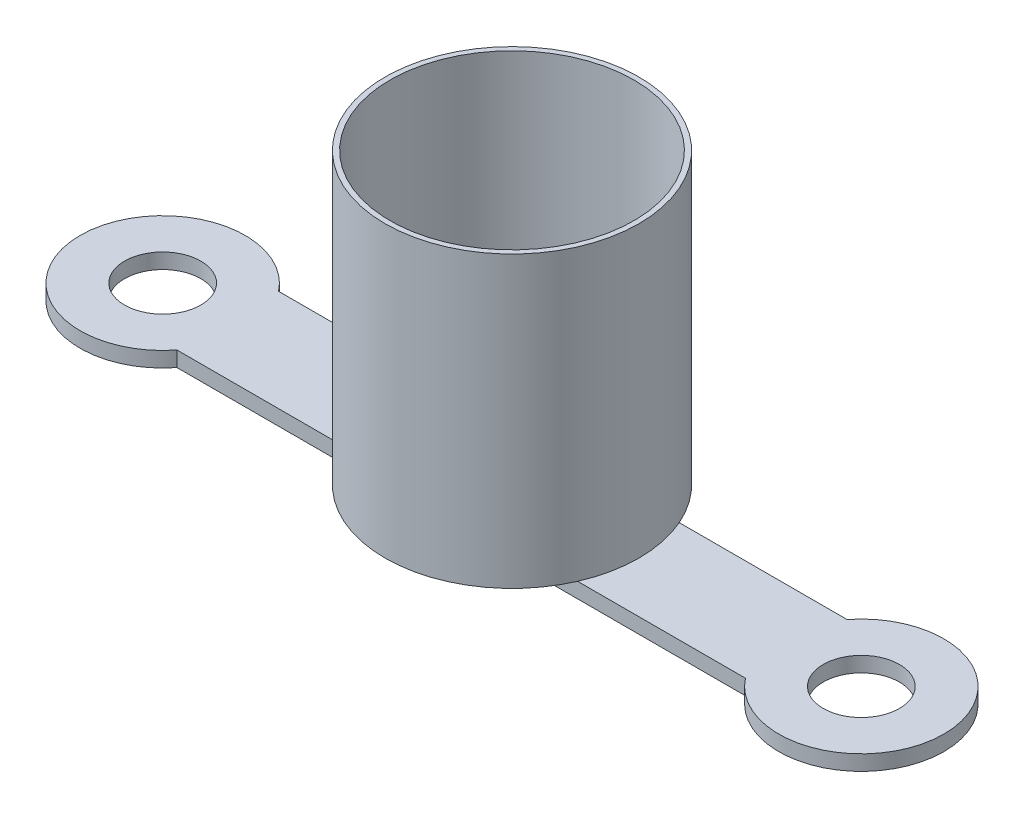
ISO-10303-21;
HEADER;
FILE_DESCRIPTION(('STEP AP214'),'2;1');
FILE_NAME('part.step','',(''),(''),'','','');
FILE_SCHEMA(('AUTOMOTIVE_DESIGN { 1 0 10303 214 1 1 1 1 }'));
ENDSEC;
DATA;
#1=APPLICATION_CONTEXT('core data for automotive mechanical design processes');
#2=APPLICATION_PROTOCOL_DEFINITION('international standard','automotive_design',2000,#1);
#3=PRODUCT_CONTEXT('',#1,'mechanical');
#4=PRODUCT('Part','Part','',(#3));
#5=PRODUCT_RELATED_PRODUCT_CATEGORY('part','',(#4));
#6=PRODUCT_DEFINITION_FORMATION('','',#4);
#7=PRODUCT_DEFINITION_CONTEXT('part definition',#1,'design');
#8=PRODUCT_DEFINITION('design','',#6,#7);
#9=PRODUCT_DEFINITION_SHAPE('','',#8);
#10=(LENGTH_UNIT() NAMED_UNIT(*) SI_UNIT(.MILLI.,.METRE.));
#11=(NAMED_UNIT(*) PLANE_ANGLE_UNIT() SI_UNIT($,.RADIAN.));
#12=(NAMED_UNIT(*) SI_UNIT($,.STERADIAN.) SOLID_ANGLE_UNIT());
#13=UNCERTAINTY_MEASURE_WITH_UNIT(LENGTH_MEASURE(1.E-05),#10,'distance_accuracy_value','');
#14=(GEOMETRIC_REPRESENTATION_CONTEXT(3) GLOBAL_UNCERTAINTY_ASSIGNED_CONTEXT((#13)) GLOBAL_UNIT_ASSIGNED_CONTEXT((#10,
#11,#12)) REPRESENTATION_CONTEXT('',''));
#15=CARTESIAN_POINT('',(0.,0.,0.));
#16=DIRECTION('',(0.,0.,1.));
#17=DIRECTION('',(1.,0.,0.));
#18=AXIS2_PLACEMENT_3D('',#15,#16,#17);
#19=CARTESIAN_POINT('',(0.,0.6,0.));
#20=DIRECTION('',(0.,1.,0.));
#21=DIRECTION('',(0.,0.,1.));
#22=AXIS2_PLACEMENT_3D('',#19,#20,#21);
#23=PLANE('',#22);
#24=CARTESIAN_POINT('',(13.75,0.6,0.));
#25=DIRECTION('',(0.,1.,0.));
#26=DIRECTION('',(0.,0.,1.));
#27=AXIS2_PLACEMENT_3D('',#24,#25,#26);
#28=CIRCLE('',#27,5.);
#29=CARTESIAN_POINT('',(18.3325756949558,0.6,2.));
#30=VERTEX_POINT('',#29);
#31=CARTESIAN_POINT('',(18.3325756949558,0.6,-2.));
#32=VERTEX_POINT('',#31);
#33=EDGE_CURVE('E125',#30,#32,#28,.T.);
#34=ORIENTED_EDGE('',*,*,#33,.F.);
#35=DIRECTION('',(1.,0.,0.));
#36=VECTOR('',#35,1.);
#37=CARTESIAN_POINT('',(0.,0.6,2.));
#38=LINE('',#37,#36);
#39=CARTESIAN_POINT('',(24.9382623085101,0.6,2.));
#40=VERTEX_POINT('',#39);
#41=EDGE_CURVE('E108',#30,#40,#38,.T.);
#42=ORIENTED_EDGE('',*,*,#41,.T.);
#43=CARTESIAN_POINT('',(27.5,0.6,0.));
#44=DIRECTION('',(0.,1.,0.));
#45=DIRECTION('',(0.,0.,1.));
#46=AXIS2_PLACEMENT_3D('',#43,#44,#45);
#47=CIRCLE('',#46,3.25);
#48=CARTESIAN_POINT('',(24.9382623085101,0.6,-2.));
#49=VERTEX_POINT('',#48);
#50=EDGE_CURVE('E105',#40,#49,#47,.T.);
#51=ORIENTED_EDGE('',*,*,#50,.T.);
#52=DIRECTION('',(-1.,0.,0.));
#53=VECTOR('',#52,1.);
#54=CARTESIAN_POINT('',(0.,0.6,-2.));
#55=LINE('',#54,#53);
#56=EDGE_CURVE('E335',#49,#32,#55,.T.);
#57=ORIENTED_EDGE('',*,*,#56,.T.);
#58=EDGE_LOOP('',(#34,#42,#51,#57));
#59=FACE_BOUND('',#58,.T.);
#60=CARTESIAN_POINT('',(27.5,0.6,0.));
#61=DIRECTION('',(0.,1.,0.));
#62=DIRECTION('',(0.,0.,1.));
#63=AXIS2_PLACEMENT_3D('',#60,#61,#62);
#64=CIRCLE('',#63,1.5);
#65=CARTESIAN_POINT('',(27.5,0.6,1.5));
#66=VERTEX_POINT('',#65);
#67=EDGE_CURVE('E340',#66,#66,#64,.T.);
#68=ORIENTED_EDGE('',*,*,#67,.F.);
#69=EDGE_LOOP('',(#68));
#70=FACE_BOUND('',#69,.T.);
#71=ADVANCED_FACE('F43',(#59,#70),#23,.T.);
#72=CARTESIAN_POINT('',(0.,0.6,0.));
#73=DIRECTION('',(0.,-1.,0.));
#74=DIRECTION('',(0.,0.,-1.));
#75=AXIS2_PLACEMENT_3D('',#72,#73,#74);
#76=CYLINDRICAL_SURFACE('',#75,3.25);
#77=CARTESIAN_POINT('',(0.,0.,0.));
#78=DIRECTION('',(0.,1.,0.));
#79=DIRECTION('',(0.,0.,1.));
#80=AXIS2_PLACEMENT_3D('',#77,#78,#79);
#81=CIRCLE('',#80,3.25);
#82=CARTESIAN_POINT('',(2.5617376914899,0.,-2.));
#83=VERTEX_POINT('',#82);
#84=CARTESIAN_POINT('',(2.5617376914899,0.,2.));
#85=VERTEX_POINT('',#84);
#86=EDGE_CURVE('E384',#83,#85,#81,.T.);
#87=ORIENTED_EDGE('',*,*,#86,.T.);
#88=DIRECTION('',(0.,-1.,0.));
#89=VECTOR('',#88,1.);
#90=CARTESIAN_POINT('',(2.5617376914899,0.6,2.));
#91=LINE('',#90,#89);
#92=CARTESIAN_POINT('',(2.5617376914899,0.6,2.));
#93=VERTEX_POINT('',#92);
#94=EDGE_CURVE('E131',#93,#85,#91,.T.);
#95=ORIENTED_EDGE('',*,*,#94,.F.);
#96=CARTESIAN_POINT('',(0.,0.6,0.));
#97=DIRECTION('',(0.,1.,0.));
#98=DIRECTION('',(0.,0.,1.));
#99=AXIS2_PLACEMENT_3D('',#96,#97,#98);
#100=CIRCLE('',#99,3.25);
#101=CARTESIAN_POINT('',(2.5617376914899,0.6,-2.));
#102=VERTEX_POINT('',#101);
#103=EDGE_CURVE('E100',#102,#93,#100,.T.);
#104=ORIENTED_EDGE('',*,*,#103,.F.);
#105=DIRECTION('',(0.,-1.,0.));
#106=VECTOR('',#105,1.);
#107=CARTESIAN_POINT('',(2.5617376914899,0.6,-2.));
#108=LINE('',#107,#106);
#109=EDGE_CURVE('E345',#102,#83,#108,.T.);
#110=ORIENTED_EDGE('',*,*,#109,.T.);
#111=EDGE_LOOP('',(#87,#95,#104,#110));
#112=FACE_BOUND('',#111,.T.);
#113=ADVANCED_FACE('F165',(#112),#76,.T.);
#114=CARTESIAN_POINT('',(0.,0.6,2.));
#115=DIRECTION('',(0.,0.,-1.));
#116=DIRECTION('',(-1.,0.,0.));
#117=AXIS2_PLACEMENT_3D('',#114,#115,#116);
#118=PLANE('',#117);
#119=DIRECTION('',(1.,0.,0.));
#120=VECTOR('',#119,1.);
#121=CARTESIAN_POINT('',(0.,0.,2.));
#122=LINE('',#121,#120);
#123=CARTESIAN_POINT('',(24.9382623085101,0.,2.));
#124=VERTEX_POINT('',#123);
#125=EDGE_CURVE('E381',#85,#124,#122,.T.);
#126=ORIENTED_EDGE('',*,*,#125,.T.);
#127=DIRECTION('',(0.,-1.,0.));
#128=VECTOR('',#127,1.);
#129=CARTESIAN_POINT('',(24.9382623085101,0.6,2.));
#130=LINE('',#129,#128);
#131=EDGE_CURVE('E133',#40,#124,#130,.T.);
#132=ORIENTED_EDGE('',*,*,#131,.F.);
#133=ORIENTED_EDGE('',*,*,#41,.F.);
#134=CARTESIAN_POINT('',(9.16742430504416,0.6,2.));
#135=VERTEX_POINT('',#134);
#136=EDGE_CURVE('E106',#135,#30,#38,.T.);
#137=ORIENTED_EDGE('',*,*,#136,.F.);
#138=EDGE_CURVE('E95',#93,#135,#38,.T.);
#139=ORIENTED_EDGE('',*,*,#138,.F.);
#140=ORIENTED_EDGE('',*,*,#94,.T.);
#141=EDGE_LOOP('',(#126,#132,#133,#137,#139,#140));
#142=FACE_BOUND('',#141,.T.);
#143=ADVANCED_FACE('F112',(#142),#118,.F.);
#144=CARTESIAN_POINT('',(27.5,0.6,0.));
#145=DIRECTION('',(0.,-1.,0.));
#146=DIRECTION('',(0.,0.,-1.));
#147=AXIS2_PLACEMENT_3D('',#144,#145,#146);
#148=CYLINDRICAL_SURFACE('',#147,3.25);
#149=CARTESIAN_POINT('',(27.5,0.,0.));
#150=DIRECTION('',(0.,1.,0.));
#151=DIRECTION('',(0.,0.,1.));
#152=AXIS2_PLACEMENT_3D('',#149,#150,#151);
#153=CIRCLE('',#152,3.25);
#154=CARTESIAN_POINT('',(24.9382623085101,0.,-2.));
#155=VERTEX_POINT('',#154);
#156=EDGE_CURVE('E365',#124,#155,#153,.T.);
#157=ORIENTED_EDGE('',*,*,#156,.T.);
#158=DIRECTION('',(0.,-1.,0.));
#159=VECTOR('',#158,1.);
#160=CARTESIAN_POINT('',(24.9382623085101,0.6,-2.));
#161=LINE('',#160,#159);
#162=EDGE_CURVE('E372',#49,#155,#161,.T.);
#163=ORIENTED_EDGE('',*,*,#162,.F.);
#164=ORIENTED_EDGE('',*,*,#50,.F.);
#165=ORIENTED_EDGE('',*,*,#131,.T.);
#166=EDGE_LOOP('',(#157,#163,#164,#165));
#167=FACE_BOUND('',#166,.T.);
#168=ADVANCED_FACE('F194',(#167),#148,.T.);
#169=CARTESIAN_POINT('',(0.,0.6,-2.));
#170=DIRECTION('',(0.,0.,1.));
#171=DIRECTION('',(1.,0.,0.));
#172=AXIS2_PLACEMENT_3D('',#169,#170,#171);
#173=PLANE('',#172);
#174=DIRECTION('',(-1.,0.,0.));
#175=VECTOR('',#174,1.);
#176=CARTESIAN_POINT('',(0.,0.,-2.));
#177=LINE('',#176,#175);
#178=EDGE_CURVE('E360',#155,#83,#177,.T.);
#179=ORIENTED_EDGE('',*,*,#178,.T.);
#180=ORIENTED_EDGE('',*,*,#109,.F.);
#181=CARTESIAN_POINT('',(9.16742430504416,0.6,-2.));
#182=VERTEX_POINT('',#181);
#183=EDGE_CURVE('E342',#182,#102,#55,.T.);
#184=ORIENTED_EDGE('',*,*,#183,.F.);
#185=EDGE_CURVE('E65',#32,#182,#55,.T.);
#186=ORIENTED_EDGE('',*,*,#185,.F.);
#187=ORIENTED_EDGE('',*,*,#56,.F.);
#188=ORIENTED_EDGE('',*,*,#162,.T.);
#189=EDGE_LOOP('',(#179,#180,#184,#186,#187,#188));
#190=FACE_BOUND('',#189,.T.);
#191=ADVANCED_FACE('F187',(#190),#173,.F.);
#192=CARTESIAN_POINT('',(0.,0.6,0.));
#193=DIRECTION('',(0.,-1.,0.));
#194=DIRECTION('',(0.,0.,-1.));
#195=AXIS2_PLACEMENT_3D('',#192,#193,#194);
#196=CYLINDRICAL_SURFACE('',#195,1.5);
#197=CARTESIAN_POINT('',(0.,0.6,0.));
#198=DIRECTION('',(0.,1.,0.));
#199=DIRECTION('',(0.,0.,1.));
#200=AXIS2_PLACEMENT_3D('',#197,#198,#199);
#201=CIRCLE('',#200,1.5);
#202=CARTESIAN_POINT('',(0.,0.6,1.5));
#203=VERTEX_POINT('',#202);
#204=EDGE_CURVE('E353',#203,#203,#201,.T.);
#205=ORIENTED_EDGE('',*,*,#204,.T.);
#206=EDGE_LOOP('',(#205));
#207=FACE_BOUND('',#206,.T.);
#208=CARTESIAN_POINT('',(0.,0.,0.));
#209=DIRECTION('',(0.,1.,0.));
#210=DIRECTION('',(0.,0.,1.));
#211=AXIS2_PLACEMENT_3D('',#208,#209,#210);
#212=CIRCLE('',#211,1.5);
#213=CARTESIAN_POINT('',(0.,0.,1.5));
#214=VERTEX_POINT('',#213);
#215=EDGE_CURVE('E137',#214,#214,#212,.T.);
#216=ORIENTED_EDGE('',*,*,#215,.F.);
#217=EDGE_LOOP('',(#216));
#218=FACE_BOUND('',#217,.T.);
#219=ADVANCED_FACE('F45',(#207,#218),#196,.F.);
#220=CARTESIAN_POINT('',(27.5,0.6,0.));
#221=DIRECTION('',(0.,-1.,0.));
#222=DIRECTION('',(0.,0.,-1.));
#223=AXIS2_PLACEMENT_3D('',#220,#221,#222);
#224=CYLINDRICAL_SURFACE('',#223,1.5);
#225=ORIENTED_EDGE('',*,*,#67,.T.);
#226=EDGE_LOOP('',(#225));
#227=FACE_BOUND('',#226,.T.);
#228=CARTESIAN_POINT('',(27.5,0.,0.));
#229=DIRECTION('',(0.,1.,0.));
#230=DIRECTION('',(0.,0.,1.));
#231=AXIS2_PLACEMENT_3D('',#228,#229,#230);
#232=CIRCLE('',#231,1.5);
#233=CARTESIAN_POINT('',(27.5,0.,1.5));
#234=VERTEX_POINT('',#233);
#235=EDGE_CURVE('E356',#234,#234,#232,.T.);
#236=ORIENTED_EDGE('',*,*,#235,.F.);
#237=EDGE_LOOP('',(#236));
#238=FACE_BOUND('',#237,.T.);
#239=ADVANCED_FACE('F176',(#227,#238),#224,.F.);
#240=EDGE_CURVE('E52',#182,#135,#28,.T.);
#241=ORIENTED_EDGE('',*,*,#240,.F.);
#242=ORIENTED_EDGE('',*,*,#183,.T.);
#243=ORIENTED_EDGE('',*,*,#103,.T.);
#244=ORIENTED_EDGE('',*,*,#138,.T.);
#245=EDGE_LOOP('',(#241,#242,#243,#244));
#246=FACE_BOUND('',#245,.T.);
#247=ORIENTED_EDGE('',*,*,#204,.F.);
#248=EDGE_LOOP('',(#247));
#249=FACE_BOUND('',#248,.T.);
#250=ADVANCED_FACE('F97',(#246,#249),#23,.T.);
#251=CARTESIAN_POINT('',(0.,0.,0.));
#252=DIRECTION('',(0.,1.,0.));
#253=DIRECTION('',(0.,0.,1.));
#254=AXIS2_PLACEMENT_3D('',#251,#252,#253);
#255=PLANE('',#254);
#256=ORIENTED_EDGE('',*,*,#215,.T.);
#257=EDGE_LOOP('',(#256));
#258=FACE_BOUND('',#257,.T.);
#259=ORIENTED_EDGE('',*,*,#86,.F.);
#260=ORIENTED_EDGE('',*,*,#178,.F.);
#261=ORIENTED_EDGE('',*,*,#156,.F.);
#262=ORIENTED_EDGE('',*,*,#125,.F.);
#263=EDGE_LOOP('',(#259,#260,#261,#262));
#264=FACE_BOUND('',#263,.T.);
#265=ORIENTED_EDGE('',*,*,#235,.T.);
#266=EDGE_LOOP('',(#265));
#267=FACE_BOUND('',#266,.T.);
#268=ADVANCED_FACE('F175',(#258,#264,#267),#255,.F.);
#269=CARTESIAN_POINT('',(13.75,0.6,0.));
#270=DIRECTION('',(0.,1.,0.));
#271=DIRECTION('',(0.,0.,1.));
#272=AXIS2_PLACEMENT_3D('',#269,#270,#271);
#273=PLANE('',#272);
#274=EDGE_CURVE('E117',#135,#30,#28,.T.);
#275=ORIENTED_EDGE('',*,*,#274,.F.);
#276=ORIENTED_EDGE('',*,*,#136,.T.);
#277=EDGE_LOOP('',(#275,#276));
#278=FACE_BOUND('',#277,.T.);
#279=ADVANCED_FACE('F118',(#278),#273,.F.);
#280=EDGE_CURVE('E122',#32,#182,#28,.T.);
#281=ORIENTED_EDGE('',*,*,#280,.F.);
#282=ORIENTED_EDGE('',*,*,#185,.T.);
#283=EDGE_LOOP('',(#281,#282));
#284=FACE_BOUND('',#283,.T.);
#285=ADVANCED_FACE('F161',(#284),#273,.F.);
#286=CARTESIAN_POINT('',(13.75,1.2,0.));
#287=DIRECTION('',(0.,-1.,0.));
#288=DIRECTION('',(0.,0.,-1.));
#289=AXIS2_PLACEMENT_3D('',#286,#287,#288);
#290=CYLINDRICAL_SURFACE('',#289,5.);
#291=ORIENTED_EDGE('',*,*,#33,.T.);
#292=ORIENTED_EDGE('',*,*,#280,.T.);
#293=ORIENTED_EDGE('',*,*,#240,.T.);
#294=ORIENTED_EDGE('',*,*,#274,.T.);
#295=EDGE_LOOP('',(#291,#292,#293,#294));
#296=FACE_BOUND('',#295,.T.);
#297=CARTESIAN_POINT('',(13.75,12.,0.));
#298=DIRECTION('',(0.,1.,0.));
#299=DIRECTION('',(0.,0.,1.));
#300=AXIS2_PLACEMENT_3D('',#297,#298,#299);
#301=CIRCLE('',#300,5.);
#302=CARTESIAN_POINT('',(13.75,12.,5.));
#303=VERTEX_POINT('',#302);
#304=EDGE_CURVE('E123',#303,#303,#301,.T.);
#305=ORIENTED_EDGE('',*,*,#304,.F.);
#306=EDGE_LOOP('',(#305));
#307=FACE_BOUND('',#306,.T.);
#308=ADVANCED_FACE('F127',(#296,#307),#290,.T.);
#309=CARTESIAN_POINT('',(13.75,12.,0.));
#310=DIRECTION('',(0.,1.,0.));
#311=DIRECTION('',(0.,0.,1.));
#312=AXIS2_PLACEMENT_3D('',#309,#310,#311);
#313=PLANE('',#312);
#314=ORIENTED_EDGE('',*,*,#304,.T.);
#315=EDGE_LOOP('',(#314));
#316=FACE_BOUND('',#315,.T.);
#317=CARTESIAN_POINT('',(13.75,12.,0.));
#318=DIRECTION('',(0.,1.,0.));
#319=DIRECTION('',(0.,0.,1.));
#320=AXIS2_PLACEMENT_3D('',#317,#318,#319);
#321=CIRCLE('',#320,4.8);
#322=CARTESIAN_POINT('',(13.75,12.,-4.8));
#323=VERTEX_POINT('',#322);
#324=EDGE_CURVE('E143',#323,#323,#321,.T.);
#325=ORIENTED_EDGE('',*,*,#324,.F.);
#326=EDGE_LOOP('',(#325));
#327=FACE_BOUND('',#326,.T.);
#328=ADVANCED_FACE('F151',(#316,#327),#313,.T.);
#329=CARTESIAN_POINT('',(13.75,12.,0.));
#330=DIRECTION('',(0.,-1.,0.));
#331=DIRECTION('',(0.,0.,-1.));
#332=AXIS2_PLACEMENT_3D('',#329,#330,#331);
#333=CYLINDRICAL_SURFACE('',#332,4.8);
#334=CARTESIAN_POINT('',(13.75,1.2,0.));
#335=DIRECTION('',(0.,1.,0.));
#336=DIRECTION('',(0.,0.,1.));
#337=AXIS2_PLACEMENT_3D('',#334,#335,#336);
#338=CIRCLE('',#337,4.8);
#339=CARTESIAN_POINT('',(13.75,1.2,-4.8));
#340=VERTEX_POINT('',#339);
#341=EDGE_CURVE('E11',#340,#340,#338,.F.);
#342=CARTESIAN_POINT('',(13.75,12.,-4.8));
#343=CARTESIAN_POINT('',(13.75,11.8875,-4.8));
#344=CARTESIAN_POINT('',(13.75,11.775,-4.8));
#345=CARTESIAN_POINT('',(13.75,11.55,-4.8));
#346=CARTESIAN_POINT('',(13.75,11.4375,-4.8));
#347=CARTESIAN_POINT('',(13.75,11.2125,-4.8));
#348=CARTESIAN_POINT('',(13.75,11.1,-4.8));
#349=CARTESIAN_POINT('',(13.75,10.875,-4.8));
#350=CARTESIAN_POINT('',(13.75,10.7625,-4.8));
#351=CARTESIAN_POINT('',(13.75,10.5375,-4.8));
#352=CARTESIAN_POINT('',(13.75,10.425,-4.8));
#353=CARTESIAN_POINT('',(13.75,10.2,-4.8));
#354=CARTESIAN_POINT('',(13.75,10.0875,-4.8));
#355=CARTESIAN_POINT('',(13.75,9.8625,-4.8));
#356=CARTESIAN_POINT('',(13.75,9.75,-4.8));
#357=CARTESIAN_POINT('',(13.75,9.525,-4.8));
#358=CARTESIAN_POINT('',(13.75,9.4125,-4.8));
#359=CARTESIAN_POINT('',(13.75,9.1875,-4.8));
#360=CARTESIAN_POINT('',(13.75,9.075,-4.8));
#361=CARTESIAN_POINT('',(13.75,8.85,-4.8));
#362=CARTESIAN_POINT('',(13.75,8.7375,-4.8));
#363=CARTESIAN_POINT('',(13.75,8.5125,-4.8));
#364=CARTESIAN_POINT('',(13.75,8.4,-4.8));
#365=CARTESIAN_POINT('',(13.75,8.175,-4.8));
#366=CARTESIAN_POINT('',(13.75,8.0625,-4.8));
#367=CARTESIAN_POINT('',(13.75,7.8375,-4.8));
#368=CARTESIAN_POINT('',(13.75,7.725,-4.8));
#369=CARTESIAN_POINT('',(13.75,7.5,-4.8));
#370=CARTESIAN_POINT('',(13.75,7.3875,-4.8));
#371=CARTESIAN_POINT('',(13.75,7.1625,-4.8));
#372=CARTESIAN_POINT('',(13.75,7.05,-4.8));
#373=CARTESIAN_POINT('',(13.75,6.825,-4.8));
#374=CARTESIAN_POINT('',(13.75,6.7125,-4.8));
#375=CARTESIAN_POINT('',(13.75,6.4875,-4.8));
#376=CARTESIAN_POINT('',(13.75,6.375,-4.8));
#377=CARTESIAN_POINT('',(13.75,6.15,-4.8));
#378=CARTESIAN_POINT('',(13.75,6.0375,-4.8));
#379=CARTESIAN_POINT('',(13.75,5.8125,-4.8));
#380=CARTESIAN_POINT('',(13.75,5.7,-4.8));
#381=CARTESIAN_POINT('',(13.75,5.475,-4.8));
#382=CARTESIAN_POINT('',(13.75,5.3625,-4.8));
#383=CARTESIAN_POINT('',(13.75,5.1375,-4.8));
#384=CARTESIAN_POINT('',(13.75,5.025,-4.8));
#385=CARTESIAN_POINT('',(13.75,4.8,-4.8));
#386=CARTESIAN_POINT('',(13.75,4.6875,-4.8));
#387=CARTESIAN_POINT('',(13.75,4.4625,-4.8));
#388=CARTESIAN_POINT('',(13.75,4.35,-4.8));
#389=CARTESIAN_POINT('',(13.75,4.125,-4.8));
#390=CARTESIAN_POINT('',(13.75,4.0125,-4.8));
#391=CARTESIAN_POINT('',(13.75,3.7875,-4.8));
#392=CARTESIAN_POINT('',(13.75,3.675,-4.8));
#393=CARTESIAN_POINT('',(13.75,3.45,-4.8));
#394=CARTESIAN_POINT('',(13.75,3.3375,-4.8));
#395=CARTESIAN_POINT('',(13.75,3.1125,-4.8));
#396=CARTESIAN_POINT('',(13.75,3.,-4.8));
#397=CARTESIAN_POINT('',(13.75,2.775,-4.8));
#398=CARTESIAN_POINT('',(13.75,2.6625,-4.8));
#399=CARTESIAN_POINT('',(13.75,2.4375,-4.8));
#400=CARTESIAN_POINT('',(13.75,2.325,-4.8));
#401=CARTESIAN_POINT('',(13.75,2.1,-4.8));
#402=CARTESIAN_POINT('',(13.75,1.9875,-4.8));
#403=CARTESIAN_POINT('',(13.75,1.7625,-4.8));
#404=CARTESIAN_POINT('',(13.75,1.65,-4.8));
#405=CARTESIAN_POINT('',(13.75,1.425,-4.8));
#406=CARTESIAN_POINT('',(13.75,1.3125,-4.8));
#407=CARTESIAN_POINT('',(13.75,1.2,-4.8));
#408=B_SPLINE_CURVE_WITH_KNOTS('',3,(#342,#343,#344,#345,#346,#347,#348,#349,#350,#351,#352,
#353,#354,#355,#356,#357,#358,#359,#360,#361,#362,#363,#364,#365,#366,#367,#368,#369,#370,#371,
#372,#373,#374,#375,#376,#377,#378,#379,#380,#381,#382,#383,#384,#385,#386,#387,#388,#389,#390,
#391,#392,#393,#394,#395,#396,#397,#398,#399,#400,#401,#402,#403,#404,#405,#406,#407),
.UNSPECIFIED.,.F.,.F.,(4,2,2,2,2,2,2,2,2,2,2,2,2,2,2,2,2,2,2,2,2,2,2,2,2,2,2,2,2,2,2,2,4),(0.,
0.337499999999999,0.674999999999998,1.0125,1.35,1.6875,2.025,2.3625,2.7,3.0375,3.375,3.7125,
4.05,4.3875,4.725,5.0625,5.4,5.7375,6.075,6.4125,6.75,7.0875,7.425,7.7625,8.1,8.4375,8.775,
9.1125,9.45,9.7875,10.125,10.4625,10.8),.UNSPECIFIED.);
#409=EDGE_CURVE('BSEAM148',#323,#340,#408,.T.);
#410=ORIENTED_EDGE('',*,*,#324,.T.);
#411=ORIENTED_EDGE('',*,*,#341,.T.);
#412=ORIENTED_EDGE('',*,*,#409,.T.);
#413=ORIENTED_EDGE('',*,*,#409,.F.);
#414=EDGE_LOOP('',(#410,#412,#411,#413));
#415=FACE_BOUND('',#414,.T.);
#416=ADVANCED_FACE('F148',(#415),#333,.F.);
#417=CARTESIAN_POINT('',(13.75,1.2,0.));
#418=DIRECTION('',(0.,1.,0.));
#419=DIRECTION('',(0.,0.,1.));
#420=AXIS2_PLACEMENT_3D('',#417,#418,#419);
#421=PLANE('',#420);
#422=ORIENTED_EDGE('',*,*,#341,.F.);
#423=EDGE_LOOP('',(#422));
#424=FACE_BOUND('',#423,.T.);
#425=ADVANCED_FACE('F159',(#424),#421,.T.);
#426=CLOSED_SHELL('',(#71,#113,#143,#168,#191,#219,#239,#250,#268,#279,#285,#308,#328,#416,#425));
#427=MANIFOLD_SOLID_BREP('B2',#426);
#428=ADVANCED_BREP_SHAPE_REPRESENTATION('',(#18,#427),#14);
#429=SHAPE_DEFINITION_REPRESENTATION(#9,#428);
ENDSEC;
END-ISO-10303-21;
